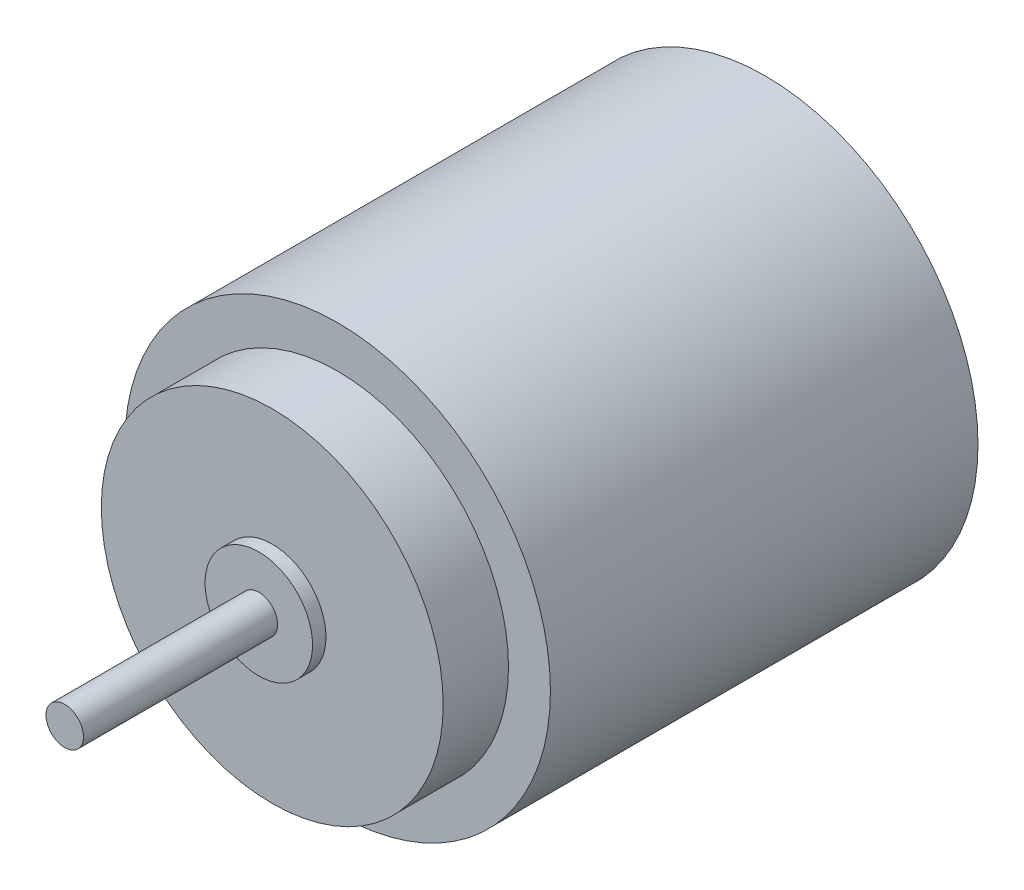
ISO-10303-21;
HEADER;
FILE_DESCRIPTION(('STEP AP214'),'2;1');
FILE_NAME('part.step','',(''),(''),'','','');
FILE_SCHEMA(('AUTOMOTIVE_DESIGN { 1 0 10303 214 1 1 1 1 }'));
ENDSEC;
DATA;
#1=APPLICATION_CONTEXT('core data for automotive mechanical design processes');
#2=APPLICATION_PROTOCOL_DEFINITION('international standard','automotive_design',2000,#1);
#3=PRODUCT_CONTEXT('',#1,'mechanical');
#4=PRODUCT('Part','Part','',(#3));
#5=PRODUCT_RELATED_PRODUCT_CATEGORY('part','',(#4));
#6=PRODUCT_DEFINITION_FORMATION('','',#4);
#7=PRODUCT_DEFINITION_CONTEXT('part definition',#1,'design');
#8=PRODUCT_DEFINITION('design','',#6,#7);
#9=PRODUCT_DEFINITION_SHAPE('','',#8);
#10=(LENGTH_UNIT() NAMED_UNIT(*) SI_UNIT(.MILLI.,.METRE.));
#11=(NAMED_UNIT(*) PLANE_ANGLE_UNIT() SI_UNIT($,.RADIAN.));
#12=(NAMED_UNIT(*) SI_UNIT($,.STERADIAN.) SOLID_ANGLE_UNIT());
#13=UNCERTAINTY_MEASURE_WITH_UNIT(LENGTH_MEASURE(1.E-05),#10,'distance_accuracy_value','');
#14=(GEOMETRIC_REPRESENTATION_CONTEXT(3) GLOBAL_UNCERTAINTY_ASSIGNED_CONTEXT((#13)) GLOBAL_UNIT_ASSIGNED_CONTEXT((#10,
#11,#12)) REPRESENTATION_CONTEXT('',''));
#15=CARTESIAN_POINT('',(0.,0.,0.));
#16=DIRECTION('',(0.,0.,1.));
#17=DIRECTION('',(1.,0.,0.));
#18=AXIS2_PLACEMENT_3D('',#15,#16,#17);
#19=CARTESIAN_POINT('',(0.,0.,23.4442));
#20=DIRECTION('',(0.,0.,-1.));
#21=DIRECTION('',(-1.,0.,0.));
#22=AXIS2_PLACEMENT_3D('',#19,#20,#21);
#23=CYLINDRICAL_SURFACE('',#22,11.6713);
#24=CARTESIAN_POINT('',(0.,0.,23.4442));
#25=DIRECTION('',(0.,0.,1.));
#26=DIRECTION('',(1.,0.,0.));
#27=AXIS2_PLACEMENT_3D('',#24,#25,#26);
#28=CIRCLE('',#27,11.6713);
#29=CARTESIAN_POINT('',(11.6713,0.,23.4442));
#30=VERTEX_POINT('',#29);
#31=EDGE_CURVE('E68',#30,#30,#28,.T.);
#32=ORIENTED_EDGE('',*,*,#31,.F.);
#33=EDGE_LOOP('',(#32));
#34=FACE_BOUND('',#33,.T.);
#35=CARTESIAN_POINT('',(0.,0.,0.));
#36=DIRECTION('',(0.,0.,1.));
#37=DIRECTION('',(1.,0.,0.));
#38=AXIS2_PLACEMENT_3D('',#35,#36,#37);
#39=CIRCLE('',#38,11.6713);
#40=CARTESIAN_POINT('',(11.6713,0.,0.));
#41=VERTEX_POINT('',#40);
#42=EDGE_CURVE('E42',#41,#41,#39,.T.);
#43=ORIENTED_EDGE('',*,*,#42,.T.);
#44=EDGE_LOOP('',(#43));
#45=FACE_BOUND('',#44,.T.);
#46=ADVANCED_FACE('F39',(#34,#45),#23,.T.);
#47=CARTESIAN_POINT('',(0.,0.,23.4442));
#48=DIRECTION('',(0.,0.,1.));
#49=DIRECTION('',(1.,0.,0.));
#50=AXIS2_PLACEMENT_3D('',#47,#48,#49);
#51=PLANE('',#50);
#52=CARTESIAN_POINT('',(0.,0.,23.4442));
#53=DIRECTION('',(0.,0.,1.));
#54=DIRECTION('',(1.,0.,0.));
#55=AXIS2_PLACEMENT_3D('',#52,#53,#54);
#56=CIRCLE('',#55,9.3726);
#57=CARTESIAN_POINT('',(9.3726,0.,23.4442));
#58=VERTEX_POINT('',#57);
#59=EDGE_CURVE('E53',#58,#58,#56,.T.);
#60=ORIENTED_EDGE('',*,*,#59,.F.);
#61=EDGE_LOOP('',(#60));
#62=FACE_BOUND('',#61,.T.);
#63=ORIENTED_EDGE('',*,*,#31,.T.);
#64=EDGE_LOOP('',(#63));
#65=FACE_BOUND('',#64,.T.);
#66=ADVANCED_FACE('F81',(#62,#65),#51,.T.);
#67=CARTESIAN_POINT('',(0.,0.,0.));
#68=DIRECTION('',(0.,0.,1.));
#69=DIRECTION('',(1.,0.,0.));
#70=AXIS2_PLACEMENT_3D('',#67,#68,#69);
#71=PLANE('',#70);
#72=ORIENTED_EDGE('',*,*,#42,.F.);
#73=EDGE_LOOP('',(#72));
#74=FACE_BOUND('',#73,.T.);
#75=ADVANCED_FACE('F78',(#74),#71,.F.);
#76=CARTESIAN_POINT('',(0.,0.,27.0256));
#77=DIRECTION('',(0.,0.,-1.));
#78=DIRECTION('',(-1.,0.,0.));
#79=AXIS2_PLACEMENT_3D('',#76,#77,#78);
#80=CYLINDRICAL_SURFACE('',#79,9.3726);
#81=CARTESIAN_POINT('',(0.,0.,27.0256));
#82=DIRECTION('',(0.,0.,1.));
#83=DIRECTION('',(1.,0.,0.));
#84=AXIS2_PLACEMENT_3D('',#81,#82,#83);
#85=CIRCLE('',#84,9.3726);
#86=CARTESIAN_POINT('',(9.3726,0.,27.0256));
#87=VERTEX_POINT('',#86);
#88=EDGE_CURVE('E61',#87,#87,#85,.T.);
#89=ORIENTED_EDGE('',*,*,#88,.F.);
#90=EDGE_LOOP('',(#89));
#91=FACE_BOUND('',#90,.T.);
#92=ORIENTED_EDGE('',*,*,#59,.T.);
#93=EDGE_LOOP('',(#92));
#94=FACE_BOUND('',#93,.T.);
#95=ADVANCED_FACE('F80',(#91,#94),#80,.T.);
#96=CARTESIAN_POINT('',(0.,0.,27.0256));
#97=DIRECTION('',(0.,0.,1.));
#98=DIRECTION('',(1.,0.,0.));
#99=AXIS2_PLACEMENT_3D('',#96,#97,#98);
#100=PLANE('',#99);
#101=CARTESIAN_POINT('',(0.,0.,27.0256));
#102=DIRECTION('',(0.,0.,1.));
#103=DIRECTION('',(1.,0.,0.));
#104=AXIS2_PLACEMENT_3D('',#101,#102,#103);
#105=CIRCLE('',#104,2.9464);
#106=CARTESIAN_POINT('',(2.9464,0.,27.0256));
#107=VERTEX_POINT('',#106);
#108=EDGE_CURVE('E47',#107,#107,#105,.T.);
#109=ORIENTED_EDGE('',*,*,#108,.F.);
#110=EDGE_LOOP('',(#109));
#111=FACE_BOUND('',#110,.T.);
#112=ORIENTED_EDGE('',*,*,#88,.T.);
#113=EDGE_LOOP('',(#112));
#114=FACE_BOUND('',#113,.T.);
#115=ADVANCED_FACE('F86',(#111,#114),#100,.T.);
#116=CARTESIAN_POINT('',(0.,0.,27.7622));
#117=DIRECTION('',(0.,0.,-1.));
#118=DIRECTION('',(-1.,0.,0.));
#119=AXIS2_PLACEMENT_3D('',#116,#117,#118);
#120=CYLINDRICAL_SURFACE('',#119,2.9464);
#121=CARTESIAN_POINT('',(0.,0.,27.7622));
#122=DIRECTION('',(0.,0.,1.));
#123=DIRECTION('',(1.,0.,0.));
#124=AXIS2_PLACEMENT_3D('',#121,#122,#123);
#125=CIRCLE('',#124,2.9464);
#126=CARTESIAN_POINT('',(2.9464,0.,27.7622));
#127=VERTEX_POINT('',#126);
#128=EDGE_CURVE('E58',#127,#127,#125,.T.);
#129=ORIENTED_EDGE('',*,*,#128,.F.);
#130=EDGE_LOOP('',(#129));
#131=FACE_BOUND('',#130,.T.);
#132=ORIENTED_EDGE('',*,*,#108,.T.);
#133=EDGE_LOOP('',(#132));
#134=FACE_BOUND('',#133,.T.);
#135=ADVANCED_FACE('F116',(#131,#134),#120,.T.);
#136=CARTESIAN_POINT('',(0.,0.,27.7622));
#137=DIRECTION('',(0.,0.,1.));
#138=DIRECTION('',(1.,0.,0.));
#139=AXIS2_PLACEMENT_3D('',#136,#137,#138);
#140=PLANE('',#139);
#141=CARTESIAN_POINT('',(0.,0.,27.7622));
#142=DIRECTION('',(0.,0.,1.));
#143=DIRECTION('',(1.,0.,0.));
#144=AXIS2_PLACEMENT_3D('',#141,#142,#143);
#145=CIRCLE('',#144,1.0287);
#146=CARTESIAN_POINT('',(1.0287,0.,27.7622));
#147=VERTEX_POINT('',#146);
#148=EDGE_CURVE('E10',#147,#147,#145,.T.);
#149=ORIENTED_EDGE('',*,*,#148,.F.);
#150=EDGE_LOOP('',(#149));
#151=FACE_BOUND('',#150,.T.);
#152=ORIENTED_EDGE('',*,*,#128,.T.);
#153=EDGE_LOOP('',(#152));
#154=FACE_BOUND('',#153,.T.);
#155=ADVANCED_FACE('F126',(#151,#154),#140,.T.);
#156=CARTESIAN_POINT('',(0.,0.,38.4048));
#157=DIRECTION('',(0.,0.,-1.));
#158=DIRECTION('',(-1.,0.,0.));
#159=AXIS2_PLACEMENT_3D('',#156,#157,#158);
#160=CYLINDRICAL_SURFACE('',#159,1.0287);
#161=CARTESIAN_POINT('',(0.,0.,38.4048));
#162=DIRECTION('',(0.,0.,1.));
#163=DIRECTION('',(1.,0.,0.));
#164=AXIS2_PLACEMENT_3D('',#161,#162,#163);
#165=CIRCLE('',#164,1.0287);
#166=CARTESIAN_POINT('',(1.0287,0.,38.4048));
#167=VERTEX_POINT('',#166);
#168=EDGE_CURVE('E57',#167,#167,#165,.T.);
#169=ORIENTED_EDGE('',*,*,#168,.F.);
#170=EDGE_LOOP('',(#169));
#171=FACE_BOUND('',#170,.T.);
#172=ORIENTED_EDGE('',*,*,#148,.T.);
#173=EDGE_LOOP('',(#172));
#174=FACE_BOUND('',#173,.T.);
#175=ADVANCED_FACE('F136',(#171,#174),#160,.T.);
#176=CARTESIAN_POINT('',(0.,0.,38.4048));
#177=DIRECTION('',(0.,0.,1.));
#178=DIRECTION('',(1.,0.,0.));
#179=AXIS2_PLACEMENT_3D('',#176,#177,#178);
#180=PLANE('',#179);
#181=ORIENTED_EDGE('',*,*,#168,.T.);
#182=EDGE_LOOP('',(#181));
#183=FACE_BOUND('',#182,.T.);
#184=ADVANCED_FACE('F146',(#183),#180,.T.);
#185=CLOSED_SHELL('',(#46,#66,#75,#95,#115,#135,#155,#175,#184));
#186=MANIFOLD_SOLID_BREP('B2',#185);
#187=ADVANCED_BREP_SHAPE_REPRESENTATION('',(#18,#186),#14);
#188=SHAPE_DEFINITION_REPRESENTATION(#9,#187);
ENDSEC;
END-ISO-10303-21;
